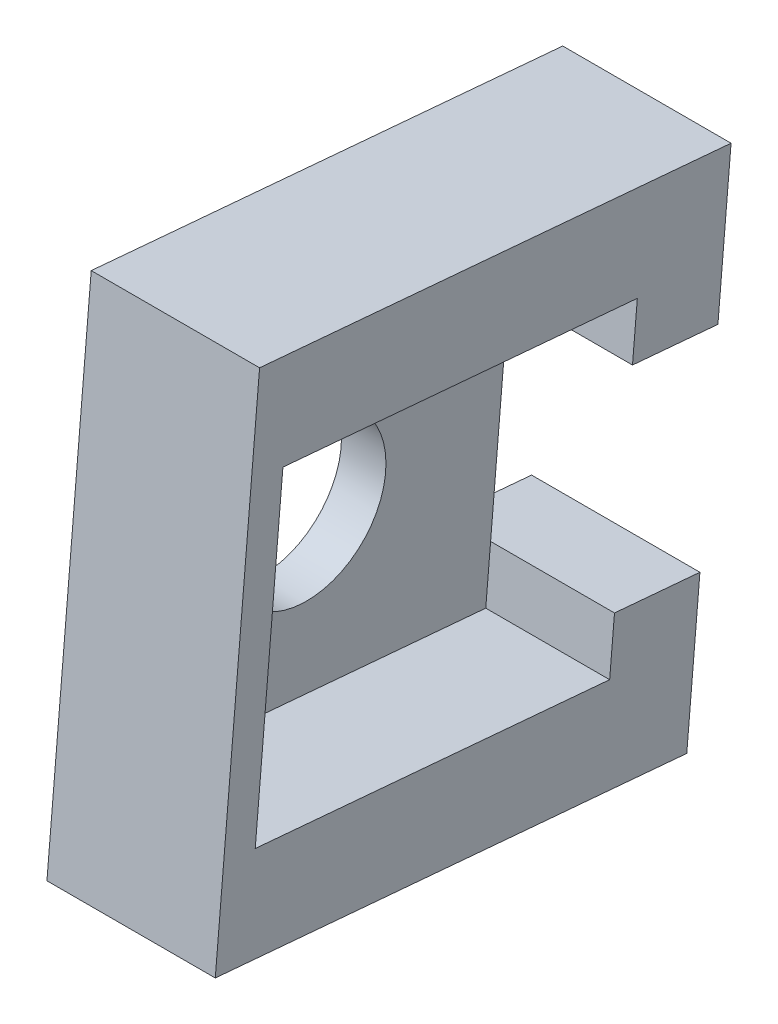
ISO-10303-21;
HEADER;
FILE_DESCRIPTION(('STEP AP214'),'2;1');
FILE_NAME('part.step','',(''),(''),'','','');
FILE_SCHEMA(('AUTOMOTIVE_DESIGN { 1 0 10303 214 1 1 1 1 }'));
ENDSEC;
DATA;
#1=APPLICATION_CONTEXT('core data for automotive mechanical design processes');
#2=APPLICATION_PROTOCOL_DEFINITION('international standard','automotive_design',2000,#1);
#3=PRODUCT_CONTEXT('',#1,'mechanical');
#4=PRODUCT('Part','Part','',(#3));
#5=PRODUCT_RELATED_PRODUCT_CATEGORY('part','',(#4));
#6=PRODUCT_DEFINITION_FORMATION('','',#4);
#7=PRODUCT_DEFINITION_CONTEXT('part definition',#1,'design');
#8=PRODUCT_DEFINITION('design','',#6,#7);
#9=PRODUCT_DEFINITION_SHAPE('','',#8);
#10=(LENGTH_UNIT() NAMED_UNIT(*) SI_UNIT(.MILLI.,.METRE.));
#11=(NAMED_UNIT(*) PLANE_ANGLE_UNIT() SI_UNIT($,.RADIAN.));
#12=(NAMED_UNIT(*) SI_UNIT($,.STERADIAN.) SOLID_ANGLE_UNIT());
#13=UNCERTAINTY_MEASURE_WITH_UNIT(LENGTH_MEASURE(1.E-05),#10,'distance_accuracy_value','');
#14=(GEOMETRIC_REPRESENTATION_CONTEXT(3) GLOBAL_UNCERTAINTY_ASSIGNED_CONTEXT((#13)) GLOBAL_UNIT_ASSIGNED_CONTEXT((#10,
#11,#12)) REPRESENTATION_CONTEXT('',''));
#15=CARTESIAN_POINT('',(0.,0.,0.));
#16=DIRECTION('',(0.,0.,1.));
#17=DIRECTION('',(1.,0.,0.));
#18=AXIS2_PLACEMENT_3D('',#15,#16,#17);
#19=CARTESIAN_POINT('',(0.,-0.771450948408242,-8.81772468932179));
#20=DIRECTION('',(0.,0.0871557427476508,0.996194698091746));
#21=DIRECTION('',(0.,-0.996194698091746,0.0871557427476508));
#22=AXIS2_PLACEMENT_3D('',#19,#20,#21);
#23=PLANE('',#22);
#24=DIRECTION('',(0.,-0.996194698091746,0.0871557427476508));
#25=VECTOR('',#24,1.);
#26=CARTESIAN_POINT('',(13.9,-50.7264702423465,-4.44722681488376));
#27=LINE('',#26,#25);
#28=CARTESIAN_POINT('',(13.9,-50.7264702423465,-4.44722681488376));
#29=VERTEX_POINT('',#28);
#30=CARTESIAN_POINT('',(13.9,-55.4583950582823,-4.03323703683242));
#31=VERTEX_POINT('',#30);
#32=EDGE_CURVE('E180',#29,#31,#27,.T.);
#33=ORIENTED_EDGE('',*,*,#32,.T.);
#34=DIRECTION('',(1.,0.,0.));
#35=VECTOR('',#34,1.);
#36=CARTESIAN_POINT('',(-16.1311755165637,-55.4583950582823,-4.03323703683242));
#37=LINE('',#36,#35);
#38=CARTESIAN_POINT('',(8.6,-55.4583950582823,-4.03323703683242));
#39=VERTEX_POINT('',#38);
#40=EDGE_CURVE('E140',#39,#31,#37,.T.);
#41=ORIENTED_EDGE('',*,*,#40,.F.);
#42=DIRECTION('',(0.,0.996194698091746,-0.0871557427476508));
#43=VECTOR('',#42,1.);
#44=CARTESIAN_POINT('',(8.6,-50.7264702423465,-4.44722681488376));
#45=LINE('',#44,#43);
#46=CARTESIAN_POINT('',(8.6,-50.7264702423465,-4.44722681488376));
#47=VERTEX_POINT('',#46);
#48=EDGE_CURVE('E185',#39,#47,#45,.T.);
#49=ORIENTED_EDGE('',*,*,#48,.T.);
#50=DIRECTION('',(1.,0.,0.));
#51=VECTOR('',#50,1.);
#52=CARTESIAN_POINT('',(8.6,-50.7264702423465,-4.44722681488376));
#53=LINE('',#52,#51);
#54=EDGE_CURVE('E182',#47,#29,#53,.T.);
#55=ORIENTED_EDGE('',*,*,#54,.T.);
#56=EDGE_LOOP('',(#33,#41,#49,#55));
#57=FACE_BOUND('',#56,.T.);
#58=ADVANCED_FACE('F39',(#57),#23,.F.);
#59=CARTESIAN_POINT('',(10.,-63.4416808121206,-0.624476474316591));
#60=DIRECTION('',(0.,-0.0871557427476503,-0.996194698091746));
#61=DIRECTION('',(0.,0.996194698091746,-0.0871557427476503));
#62=AXIS2_PLACEMENT_3D('',#59,#60,#61);
#63=PLANE('',#62);
#64=DIRECTION('',(0.,0.996194698091746,-0.0871557427476503));
#65=VECTOR('',#64,1.);
#66=CARTESIAN_POINT('',(10.,-63.4416808121206,-0.624476474316591));
#67=LINE('',#66,#65);
#68=CARTESIAN_POINT('',(10.,-55.2230745528637,-1.34351135198471));
#69=VERTEX_POINT('',#68);
#70=CARTESIAN_POINT('',(10.,-53.4797338312031,-1.49603390179309));
#71=VERTEX_POINT('',#70);
#72=EDGE_CURVE('E147',#69,#71,#67,.T.);
#73=ORIENTED_EDGE('',*,*,#72,.F.);
#74=DIRECTION('',(1.,0.,0.));
#75=VECTOR('',#74,1.);
#76=CARTESIAN_POINT('',(-16.1311755165637,-55.2230745528637,-1.34351135198471));
#77=LINE('',#76,#75);
#78=CARTESIAN_POINT('',(13.9,-55.2230745528637,-1.34351135198471));
#79=VERTEX_POINT('',#78);
#80=EDGE_CURVE('E137',#69,#79,#77,.T.);
#81=ORIENTED_EDGE('',*,*,#80,.T.);
#82=DIRECTION('',(0.,0.996194698091746,-0.0871557427476503));
#83=VECTOR('',#82,1.);
#84=CARTESIAN_POINT('',(13.9,-63.4416808121206,-0.624476474316591));
#85=LINE('',#84,#83);
#86=CARTESIAN_POINT('',(13.9,-53.4797338312031,-1.49603390179309));
#87=VERTEX_POINT('',#86);
#88=EDGE_CURVE('E63',#79,#87,#85,.T.);
#89=ORIENTED_EDGE('',*,*,#88,.T.);
#90=DIRECTION('',(1.,0.,0.));
#91=VECTOR('',#90,1.);
#92=CARTESIAN_POINT('',(10.,-53.4797338312031,-1.49603390179309));
#93=LINE('',#92,#91);
#94=EDGE_CURVE('E178',#71,#87,#93,.T.);
#95=ORIENTED_EDGE('',*,*,#94,.F.);
#96=EDGE_LOOP('',(#73,#81,#89,#95));
#97=FACE_BOUND('',#96,.T.);
#98=ADVANCED_FACE('F146',(#97),#63,.F.);
#99=CARTESIAN_POINT('',(8.6,-52.1954776362627,-21.2380581604908));
#100=DIRECTION('',(-1.,0.,0.));
#101=DIRECTION('',(0.,-1.,0.));
#102=AXIS2_PLACEMENT_3D('',#99,#100,#101);
#103=PLANE('',#102);
#104=DIRECTION('',(0.,-0.0871557427476503,-0.996194698091746));
#105=VECTOR('',#104,1.);
#106=CARTESIAN_POINT('',(8.6,-56.9274024521985,-20.8240683824395));
#107=LINE('',#106,#105);
#108=CARTESIAN_POINT('',(8.60000000000001,-55.2230745528637,-1.34351135198471));
#109=VERTEX_POINT('',#108);
#110=EDGE_CURVE('E229',#109,#39,#107,.T.);
#111=ORIENTED_EDGE('',*,*,#110,.F.);
#112=DIRECTION('',(0.,0.996194698091746,-0.0871557427476507));
#113=VECTOR('',#112,1.);
#114=CARTESIAN_POINT('',(8.6,-50.4911497369279,-1.75750113003605));
#115=LINE('',#114,#113);
#116=CARTESIAN_POINT('',(8.60000000000001,-61.69834009046,-0.776999024124979));
#117=VERTEX_POINT('',#116);
#118=EDGE_CURVE('E231',#117,#109,#115,.T.);
#119=ORIENTED_EDGE('',*,*,#118,.F.);
#120=DIRECTION('',(0.,0.0871557427476503,0.996194698091746));
#121=VECTOR('',#120,1.);
#122=CARTESIAN_POINT('',(8.60000000000001,-63.4026679897949,-20.2575560545797));
#123=LINE('',#122,#121);
#124=CARTESIAN_POINT('',(8.60000000000001,-61.9336605958787,-3.46672470897269));
#125=VERTEX_POINT('',#124);
#126=EDGE_CURVE('E234',#125,#117,#123,.T.);
#127=ORIENTED_EDGE('',*,*,#126,.F.);
#128=CARTESIAN_POINT('',(8.60000000000001,-66.6655854118145,-3.05273493092135));
#129=VERTEX_POINT('',#128);
#130=EDGE_CURVE('E48',#129,#125,#45,.T.);
#131=ORIENTED_EDGE('',*,*,#130,.F.);
#132=DIRECTION('',(0.,0.0871557427476508,0.996194698091746));
#133=VECTOR('',#132,1.);
#134=CARTESIAN_POINT('',(8.60000000000001,-68.1345928057307,-19.8435662765284));
#135=LINE('',#134,#133);
#136=CARTESIAN_POINT('',(8.60000000000001,-65.3669648448745,11.7905660706457));
#137=VERTEX_POINT('',#136);
#138=EDGE_CURVE('E199',#129,#137,#135,.T.);
#139=ORIENTED_EDGE('',*,*,#138,.T.);
#140=DIRECTION('',(0.,-0.996194698091746,0.0871557427476507));
#141=VECTOR('',#140,1.);
#142=CARTESIAN_POINT('',(8.6,-49.4278496754065,10.3960741866833));
#143=LINE('',#142,#141);
#144=CARTESIAN_POINT('',(8.6,-49.4278496754065,10.3960741866833));
#145=VERTEX_POINT('',#144);
#146=EDGE_CURVE('E173',#145,#137,#143,.T.);
#147=ORIENTED_EDGE('',*,*,#146,.F.);
#148=DIRECTION('',(0.,0.0871557427476508,0.996194698091746));
#149=VECTOR('',#148,1.);
#150=CARTESIAN_POINT('',(8.6,-52.1954776362627,-21.2380581604908));
#151=LINE('',#150,#149);
#152=EDGE_CURVE('E200',#47,#145,#151,.T.);
#153=ORIENTED_EDGE('',*,*,#152,.F.);
#154=ORIENTED_EDGE('',*,*,#48,.F.);
#155=EDGE_LOOP('',(#111,#119,#127,#131,#139,#147,#153,#154));
#156=FACE_BOUND('',#155,.T.);
#157=CARTESIAN_POINT('',(8.6,-57.9290572909012,5.01653247030481));
#158=DIRECTION('',(-1.,0.,0.));
#159=DIRECTION('',(0.,-1.,0.));
#160=AXIS2_PLACEMENT_3D('',#157,#158,#159);
#161=CIRCLE('',#160,2.50000000000078);
#162=CARTESIAN_POINT('',(8.6,-60.429057290902,5.01653247030481));
#163=VERTEX_POINT('',#162);
#164=EDGE_CURVE('E43',#163,#163,#161,.T.);
#165=ORIENTED_EDGE('',*,*,#164,.F.);
#166=EDGE_LOOP('',(#165));
#167=FACE_BOUND('',#166,.T.);
#168=ADVANCED_FACE('F41',(#156,#167),#103,.T.);
#169=CARTESIAN_POINT('',(8.6,-52.1954776362627,-21.2380581604908));
#170=DIRECTION('',(0.,0.996194698091746,-0.0871557427476508));
#171=DIRECTION('',(0.,0.0871557427476508,0.996194698091746));
#172=AXIS2_PLACEMENT_3D('',#169,#170,#171);
#173=PLANE('',#172);
#174=ORIENTED_EDGE('',*,*,#54,.F.);
#175=ORIENTED_EDGE('',*,*,#152,.T.);
#176=DIRECTION('',(-1.,0.,0.));
#177=VECTOR('',#176,1.);
#178=CARTESIAN_POINT('',(8.6,-49.4278496754065,10.3960741866833));
#179=LINE('',#178,#177);
#180=CARTESIAN_POINT('',(13.9,-49.4278496754065,10.3960741866833));
#181=VERTEX_POINT('',#180);
#182=EDGE_CURVE('E196',#181,#145,#179,.T.);
#183=ORIENTED_EDGE('',*,*,#182,.F.);
#184=DIRECTION('',(0.,0.0871557427476508,0.996194698091746));
#185=VECTOR('',#184,1.);
#186=CARTESIAN_POINT('',(13.9,-52.1954776362627,-21.2380581604908));
#187=LINE('',#186,#185);
#188=EDGE_CURVE('E202',#29,#181,#187,.T.);
#189=ORIENTED_EDGE('',*,*,#188,.F.);
#190=EDGE_LOOP('',(#174,#175,#183,#189));
#191=FACE_BOUND('',#190,.T.);
#192=ADVANCED_FACE('F226',(#191),#173,.T.);
#193=CARTESIAN_POINT('',(13.9,-52.1954776362627,-21.2380581604908));
#194=DIRECTION('',(1.,0.,0.));
#195=DIRECTION('',(0.,1.,0.));
#196=AXIS2_PLACEMENT_3D('',#193,#194,#195);
#197=PLANE('',#196);
#198=DIRECTION('',(0.,0.0871557427476503,0.996194698091746));
#199=VECTOR('',#198,1.);
#200=CARTESIAN_POINT('',(13.9,-55.4583950582823,-4.03323703683242));
#201=LINE('',#200,#199);
#202=EDGE_CURVE('E135',#31,#79,#201,.T.);
#203=ORIENTED_EDGE('',*,*,#202,.F.);
#204=ORIENTED_EDGE('',*,*,#32,.F.);
#205=ORIENTED_EDGE('',*,*,#188,.T.);
#206=DIRECTION('',(0.,0.996194698091746,-0.0871557427476507));
#207=VECTOR('',#206,1.);
#208=CARTESIAN_POINT('',(13.9,-49.4278496754065,10.3960741866833));
#209=LINE('',#208,#207);
#210=CARTESIAN_POINT('',(13.9,-65.3669648448745,11.7905660706457));
#211=VERTEX_POINT('',#210);
#212=EDGE_CURVE('E193',#211,#181,#209,.T.);
#213=ORIENTED_EDGE('',*,*,#212,.F.);
#214=DIRECTION('',(0.,0.0871557427476508,0.996194698091746));
#215=VECTOR('',#214,1.);
#216=CARTESIAN_POINT('',(13.9,-68.1345928057307,-19.8435662765284));
#217=LINE('',#216,#215);
#218=CARTESIAN_POINT('',(13.9,-66.6655854118145,-3.05273493092135));
#219=VERTEX_POINT('',#218);
#220=EDGE_CURVE('E204',#219,#211,#217,.T.);
#221=ORIENTED_EDGE('',*,*,#220,.F.);
#222=CARTESIAN_POINT('',(13.9,-61.9336605958787,-3.46672470897269));
#223=VERTEX_POINT('',#222);
#224=EDGE_CURVE('E183',#223,#219,#27,.T.);
#225=ORIENTED_EDGE('',*,*,#224,.F.);
#226=DIRECTION('',(0.,-0.0871557427476503,-0.996194698091746));
#227=VECTOR('',#226,1.);
#228=CARTESIAN_POINT('',(13.9,-61.69834009046,-0.776999024124979));
#229=LINE('',#228,#227);
#230=CARTESIAN_POINT('',(13.9,-61.69834009046,-0.776999024124979));
#231=VERTEX_POINT('',#230);
#232=EDGE_CURVE('E144',#231,#223,#229,.T.);
#233=ORIENTED_EDGE('',*,*,#232,.F.);
#234=CARTESIAN_POINT('',(13.9,-63.4416808121206,-0.624476474316591));
#235=VERTEX_POINT('',#234);
#236=EDGE_CURVE('E155',#235,#231,#85,.T.);
#237=ORIENTED_EDGE('',*,*,#236,.F.);
#238=DIRECTION('',(0.,-0.0871557427476499,-0.996194698091746));
#239=VECTOR('',#238,1.);
#240=CARTESIAN_POINT('',(13.9,-62.4655364933469,10.532904144311));
#241=LINE('',#240,#239);
#242=CARTESIAN_POINT('',(13.9,-62.4655364933469,10.532904144311));
#243=VERTEX_POINT('',#242);
#244=EDGE_CURVE('E168',#243,#235,#241,.T.);
#245=ORIENTED_EDGE('',*,*,#244,.F.);
#246=DIRECTION('',(0.,-0.996194698091746,0.0871557427476506));
#247=VECTOR('',#246,1.);
#248=CARTESIAN_POINT('',(13.9,-52.5035895124294,9.66134671683446));
#249=LINE('',#248,#247);
#250=CARTESIAN_POINT('',(13.9,-52.5035895124294,9.66134671683446));
#251=VERTEX_POINT('',#250);
#252=EDGE_CURVE('E165',#251,#243,#249,.T.);
#253=ORIENTED_EDGE('',*,*,#252,.F.);
#254=DIRECTION('',(0.,0.0871557427476506,0.996194698091746));
#255=VECTOR('',#254,1.);
#256=CARTESIAN_POINT('',(13.9,-53.4797338312031,-1.49603390179309));
#257=LINE('',#256,#255);
#258=EDGE_CURVE('E154',#87,#251,#257,.T.);
#259=ORIENTED_EDGE('',*,*,#258,.F.);
#260=ORIENTED_EDGE('',*,*,#88,.F.);
#261=EDGE_LOOP('',(#203,#204,#205,#213,#221,#225,#233,#237,#245,#253,#259,#260));
#262=FACE_BOUND('',#261,.T.);
#263=ADVANCED_FACE('F151',(#262),#197,.T.);
#264=CARTESIAN_POINT('',(8.60000000000001,-68.1345928057307,-19.8435662765284));
#265=DIRECTION('',(0.,-0.996194698091746,0.0871557427476508));
#266=DIRECTION('',(0.,-0.0871557427476508,-0.996194698091746));
#267=AXIS2_PLACEMENT_3D('',#264,#265,#266);
#268=PLANE('',#267);
#269=DIRECTION('',(-1.,0.,0.));
#270=VECTOR('',#269,1.);
#271=CARTESIAN_POINT('',(8.60000000000001,-66.6655854118145,-3.05273493092135));
#272=LINE('',#271,#270);
#273=EDGE_CURVE('E11',#219,#129,#272,.T.);
#274=ORIENTED_EDGE('',*,*,#273,.F.);
#275=ORIENTED_EDGE('',*,*,#220,.T.);
#276=DIRECTION('',(1.,0.,0.));
#277=VECTOR('',#276,1.);
#278=CARTESIAN_POINT('',(8.60000000000001,-65.3669648448745,11.7905660706457));
#279=LINE('',#278,#277);
#280=EDGE_CURVE('E190',#137,#211,#279,.T.);
#281=ORIENTED_EDGE('',*,*,#280,.F.);
#282=ORIENTED_EDGE('',*,*,#138,.F.);
#283=EDGE_LOOP('',(#274,#275,#281,#282));
#284=FACE_BOUND('',#283,.T.);
#285=ADVANCED_FACE('F217',(#284),#268,.T.);
#286=CARTESIAN_POINT('',(0.,0.527169618531755,6.02557631224522));
#287=DIRECTION('',(0.,0.0871557427476507,0.996194698091746));
#288=DIRECTION('',(0.,-0.996194698091746,0.0871557427476507));
#289=AXIS2_PLACEMENT_3D('',#286,#287,#288);
#290=PLANE('',#289);
#291=ORIENTED_EDGE('',*,*,#146,.T.);
#292=ORIENTED_EDGE('',*,*,#280,.T.);
#293=ORIENTED_EDGE('',*,*,#212,.T.);
#294=ORIENTED_EDGE('',*,*,#182,.T.);
#295=EDGE_LOOP('',(#291,#292,#293,#294));
#296=FACE_BOUND('',#295,.T.);
#297=ADVANCED_FACE('F221',(#296),#290,.T.);
#298=ORIENTED_EDGE('',*,*,#130,.T.);
#299=DIRECTION('',(1.,0.,0.));
#300=VECTOR('',#299,1.);
#301=CARTESIAN_POINT('',(-16.1311755165637,-61.9336605958787,-3.46672470897269));
#302=LINE('',#301,#300);
#303=EDGE_CURVE('E232',#125,#223,#302,.T.);
#304=ORIENTED_EDGE('',*,*,#303,.T.);
#305=ORIENTED_EDGE('',*,*,#224,.T.);
#306=ORIENTED_EDGE('',*,*,#273,.T.);
#307=EDGE_LOOP('',(#298,#304,#305,#306));
#308=FACE_BOUND('',#307,.T.);
#309=ADVANCED_FACE('F275',(#308),#23,.F.);
#310=ORIENTED_EDGE('',*,*,#236,.T.);
#311=DIRECTION('',(1.,0.,0.));
#312=VECTOR('',#311,1.);
#313=CARTESIAN_POINT('',(-16.1311755165637,-61.69834009046,-0.776999024124979));
#314=LINE('',#313,#312);
#315=CARTESIAN_POINT('',(10.,-61.69834009046,-0.776999024124979));
#316=VERTEX_POINT('',#315);
#317=EDGE_CURVE('E241',#316,#231,#314,.T.);
#318=ORIENTED_EDGE('',*,*,#317,.F.);
#319=CARTESIAN_POINT('',(10.,-63.4416808121206,-0.624476474316591));
#320=VERTEX_POINT('',#319);
#321=EDGE_CURVE('E247',#320,#316,#67,.T.);
#322=ORIENTED_EDGE('',*,*,#321,.F.);
#323=DIRECTION('',(1.,0.,0.));
#324=VECTOR('',#323,1.);
#325=CARTESIAN_POINT('',(10.,-63.4416808121206,-0.624476474316591));
#326=LINE('',#325,#324);
#327=EDGE_CURVE('E171',#320,#235,#326,.T.);
#328=ORIENTED_EDGE('',*,*,#327,.T.);
#329=EDGE_LOOP('',(#310,#318,#322,#328));
#330=FACE_BOUND('',#329,.T.);
#331=ADVANCED_FACE('F267',(#330),#63,.F.);
#332=CARTESIAN_POINT('',(10.,-62.4655364933469,10.532904144311));
#333=DIRECTION('',(0.,-0.996194698091746,0.0871557427476499));
#334=DIRECTION('',(0.,-0.0871557427476499,-0.996194698091746));
#335=AXIS2_PLACEMENT_3D('',#332,#333,#334);
#336=PLANE('',#335);
#337=ORIENTED_EDGE('',*,*,#244,.T.);
#338=ORIENTED_EDGE('',*,*,#327,.F.);
#339=DIRECTION('',(0.,-0.0871557427476499,-0.996194698091746));
#340=VECTOR('',#339,1.);
#341=CARTESIAN_POINT('',(10.,-62.4655364933469,10.532904144311));
#342=LINE('',#341,#340);
#343=CARTESIAN_POINT('',(10.,-62.4655364933469,10.532904144311));
#344=VERTEX_POINT('',#343);
#345=EDGE_CURVE('E162',#344,#320,#342,.T.);
#346=ORIENTED_EDGE('',*,*,#345,.F.);
#347=DIRECTION('',(1.,0.,0.));
#348=VECTOR('',#347,1.);
#349=CARTESIAN_POINT('',(10.,-62.4655364933469,10.532904144311));
#350=LINE('',#349,#348);
#351=EDGE_CURVE('E174',#344,#243,#350,.T.);
#352=ORIENTED_EDGE('',*,*,#351,.T.);
#353=EDGE_LOOP('',(#337,#338,#346,#352));
#354=FACE_BOUND('',#353,.T.);
#355=ADVANCED_FACE('F262',(#354),#336,.F.);
#356=CARTESIAN_POINT('',(10.,-52.5035895124294,9.66134671683446));
#357=DIRECTION('',(0.,0.0871557427476506,0.996194698091746));
#358=DIRECTION('',(0.,-0.996194698091746,0.0871557427476506));
#359=AXIS2_PLACEMENT_3D('',#356,#357,#358);
#360=PLANE('',#359);
#361=ORIENTED_EDGE('',*,*,#252,.T.);
#362=ORIENTED_EDGE('',*,*,#351,.F.);
#363=DIRECTION('',(0.,-0.996194698091746,0.0871557427476506));
#364=VECTOR('',#363,1.);
#365=CARTESIAN_POINT('',(10.,-52.5035895124294,9.66134671683446));
#366=LINE('',#365,#364);
#367=CARTESIAN_POINT('',(10.,-52.5035895124294,9.66134671683446));
#368=VERTEX_POINT('',#367);
#369=EDGE_CURVE('E253',#368,#344,#366,.T.);
#370=ORIENTED_EDGE('',*,*,#369,.F.);
#371=DIRECTION('',(1.,0.,0.));
#372=VECTOR('',#371,1.);
#373=CARTESIAN_POINT('',(10.,-52.5035895124294,9.66134671683446));
#374=LINE('',#373,#372);
#375=EDGE_CURVE('E176',#368,#251,#374,.T.);
#376=ORIENTED_EDGE('',*,*,#375,.T.);
#377=EDGE_LOOP('',(#361,#362,#370,#376));
#378=FACE_BOUND('',#377,.T.);
#379=ADVANCED_FACE('F281',(#378),#360,.F.);
#380=CARTESIAN_POINT('',(10.,-53.4797338312031,-1.49603390179309));
#381=DIRECTION('',(0.,0.996194698091746,-0.0871557427476505));
#382=DIRECTION('',(0.,0.0871557427476506,0.996194698091746));
#383=AXIS2_PLACEMENT_3D('',#380,#381,#382);
#384=PLANE('',#383);
#385=ORIENTED_EDGE('',*,*,#258,.T.);
#386=ORIENTED_EDGE('',*,*,#375,.F.);
#387=DIRECTION('',(0.,0.0871557427476506,0.996194698091746));
#388=VECTOR('',#387,1.);
#389=CARTESIAN_POINT('',(10.,-53.4797338312031,-1.49603390179309));
#390=LINE('',#389,#388);
#391=EDGE_CURVE('E250',#71,#368,#390,.T.);
#392=ORIENTED_EDGE('',*,*,#391,.F.);
#393=ORIENTED_EDGE('',*,*,#94,.T.);
#394=EDGE_LOOP('',(#385,#386,#392,#393));
#395=FACE_BOUND('',#394,.T.);
#396=ADVANCED_FACE('F279',(#395),#384,.F.);
#397=CARTESIAN_POINT('',(9.99999999999999,0.,0.));
#398=DIRECTION('',(1.,0.,0.));
#399=DIRECTION('',(0.,1.,0.));
#400=AXIS2_PLACEMENT_3D('',#397,#398,#399);
#401=PLANE('',#400);
#402=CARTESIAN_POINT('',(9.99999999999999,-57.9290572909012,5.01653247030481));
#403=DIRECTION('',(1.,0.,0.));
#404=DIRECTION('',(0.,0.,-1.));
#405=AXIS2_PLACEMENT_3D('',#402,#403,#404);
#406=CIRCLE('',#405,2.50000000000078);
#407=CARTESIAN_POINT('',(9.99999999999999,-57.9290572909012,2.51653247030403));
#408=VERTEX_POINT('',#407);
#409=EDGE_CURVE('E159',#408,#408,#406,.T.);
#410=ORIENTED_EDGE('',*,*,#409,.F.);
#411=EDGE_LOOP('',(#410));
#412=FACE_BOUND('',#411,.T.);
#413=ORIENTED_EDGE('',*,*,#321,.T.);
#414=EDGE_CURVE('E251',#316,#69,#67,.T.);
#415=ORIENTED_EDGE('',*,*,#414,.T.);
#416=ORIENTED_EDGE('',*,*,#72,.T.);
#417=ORIENTED_EDGE('',*,*,#391,.T.);
#418=ORIENTED_EDGE('',*,*,#369,.T.);
#419=ORIENTED_EDGE('',*,*,#345,.T.);
#420=EDGE_LOOP('',(#413,#415,#416,#417,#418,#419));
#421=FACE_BOUND('',#420,.T.);
#422=ADVANCED_FACE('F259',(#412,#421),#401,.T.);
#423=CARTESIAN_POINT('',(-16.1311755165637,-57.9290572909012,5.01653247030481));
#424=DIRECTION('',(1.,0.,0.));
#425=DIRECTION('',(0.,0.,-1.));
#426=AXIS2_PLACEMENT_3D('',#423,#424,#425);
#427=CYLINDRICAL_SURFACE('',#426,2.50000000000078);
#428=ORIENTED_EDGE('',*,*,#164,.T.);
#429=EDGE_LOOP('',(#428));
#430=FACE_BOUND('',#429,.T.);
#431=ORIENTED_EDGE('',*,*,#409,.T.);
#432=EDGE_LOOP('',(#431));
#433=FACE_BOUND('',#432,.T.);
#434=ADVANCED_FACE('F344',(#430,#433),#427,.F.);
#435=CARTESIAN_POINT('',(-16.1311755165637,-55.4583950582823,-4.03323703683242));
#436=DIRECTION('',(0.,0.996194698091746,-0.0871557427476503));
#437=DIRECTION('',(0.,0.0871557427476503,0.996194698091746));
#438=AXIS2_PLACEMENT_3D('',#435,#436,#437);
#439=PLANE('',#438);
#440=ORIENTED_EDGE('',*,*,#110,.T.);
#441=ORIENTED_EDGE('',*,*,#40,.T.);
#442=ORIENTED_EDGE('',*,*,#202,.T.);
#443=ORIENTED_EDGE('',*,*,#80,.F.);
#444=EDGE_CURVE('E55',#109,#69,#77,.T.);
#445=ORIENTED_EDGE('',*,*,#444,.F.);
#446=EDGE_LOOP('',(#440,#441,#442,#443,#445));
#447=FACE_BOUND('',#446,.T.);
#448=ADVANCED_FACE('F136',(#447),#439,.F.);
#449=CARTESIAN_POINT('',(-16.1311755165637,-61.69834009046,-0.776999024124979));
#450=DIRECTION('',(0.,-0.996194698091746,0.0871557427476503));
#451=DIRECTION('',(0.,-0.0871557427476503,-0.996194698091746));
#452=AXIS2_PLACEMENT_3D('',#449,#450,#451);
#453=PLANE('',#452);
#454=ORIENTED_EDGE('',*,*,#126,.T.);
#455=EDGE_CURVE('E237',#117,#316,#314,.T.);
#456=ORIENTED_EDGE('',*,*,#455,.T.);
#457=ORIENTED_EDGE('',*,*,#317,.T.);
#458=ORIENTED_EDGE('',*,*,#232,.T.);
#459=ORIENTED_EDGE('',*,*,#303,.F.);
#460=EDGE_LOOP('',(#454,#456,#457,#458,#459));
#461=FACE_BOUND('',#460,.T.);
#462=ADVANCED_FACE('F271',(#461),#453,.F.);
#463=CARTESIAN_POINT('',(-16.1311755165637,-55.2230745528637,-1.34351135198471));
#464=DIRECTION('',(0.,0.0871557427476507,0.996194698091746));
#465=DIRECTION('',(0.,-0.996194698091746,0.0871557427476507));
#466=AXIS2_PLACEMENT_3D('',#463,#464,#465);
#467=PLANE('',#466);
#468=ORIENTED_EDGE('',*,*,#118,.T.);
#469=ORIENTED_EDGE('',*,*,#444,.T.);
#470=ORIENTED_EDGE('',*,*,#414,.F.);
#471=ORIENTED_EDGE('',*,*,#455,.F.);
#472=EDGE_LOOP('',(#468,#469,#470,#471));
#473=FACE_BOUND('',#472,.T.);
#474=ADVANCED_FACE('F276',(#473),#467,.F.);
#475=CLOSED_SHELL('',(#58,#98,#168,#192,#263,#285,#297,#309,#331,#355,#379,#396,#422,#434,#448,
#462,#474));
#476=MANIFOLD_SOLID_BREP('B2',#475);
#477=ADVANCED_BREP_SHAPE_REPRESENTATION('',(#18,#476),#14);
#478=SHAPE_DEFINITION_REPRESENTATION(#9,#477);
ENDSEC;
END-ISO-10303-21;
